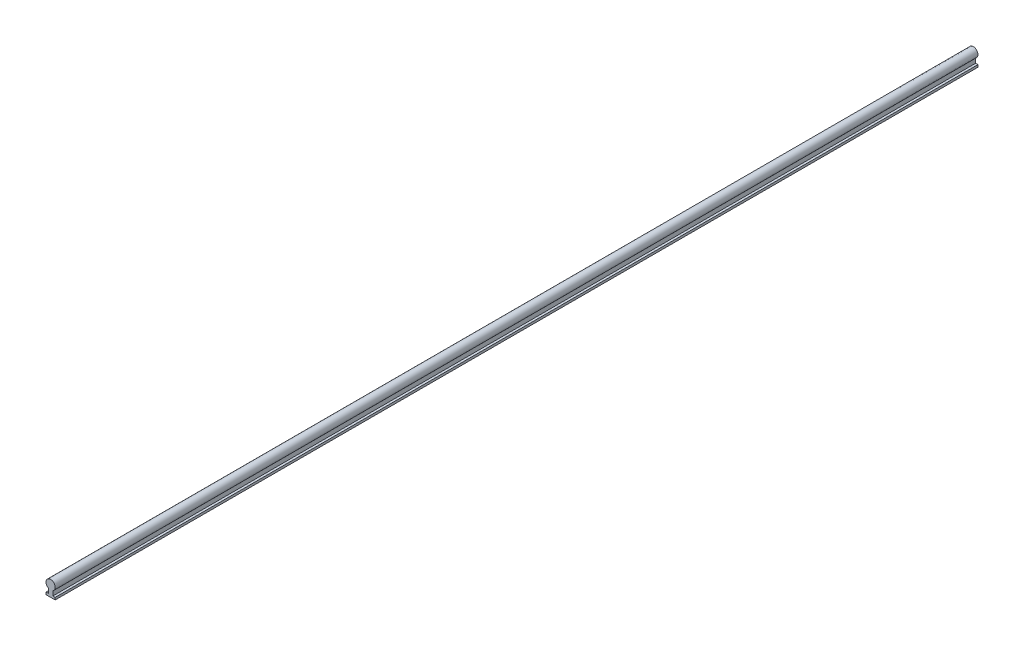
ISO-10303-21;
HEADER;
FILE_DESCRIPTION(('STEP AP214'),'2;1');
FILE_NAME('part.step','',(''),(''),'','','');
FILE_SCHEMA(('AUTOMOTIVE_DESIGN { 1 0 10303 214 1 1 1 1 }'));
ENDSEC;
DATA;
#1=APPLICATION_CONTEXT('core data for automotive mechanical design processes');
#2=APPLICATION_PROTOCOL_DEFINITION('international standard','automotive_design',2000,#1);
#3=PRODUCT_CONTEXT('',#1,'mechanical');
#4=PRODUCT('Part','Part','',(#3));
#5=PRODUCT_RELATED_PRODUCT_CATEGORY('part','',(#4));
#6=PRODUCT_DEFINITION_FORMATION('','',#4);
#7=PRODUCT_DEFINITION_CONTEXT('part definition',#1,'design');
#8=PRODUCT_DEFINITION('design','',#6,#7);
#9=PRODUCT_DEFINITION_SHAPE('','',#8);
#10=(LENGTH_UNIT() NAMED_UNIT(*) SI_UNIT(.MILLI.,.METRE.));
#11=(NAMED_UNIT(*) PLANE_ANGLE_UNIT() SI_UNIT($,.RADIAN.));
#12=(NAMED_UNIT(*) SI_UNIT($,.STERADIAN.) SOLID_ANGLE_UNIT());
#13=UNCERTAINTY_MEASURE_WITH_UNIT(LENGTH_MEASURE(1.E-05),#10,'distance_accuracy_value','');
#14=(GEOMETRIC_REPRESENTATION_CONTEXT(3) GLOBAL_UNCERTAINTY_ASSIGNED_CONTEXT((#13)) GLOBAL_UNIT_ASSIGNED_CONTEXT((#10,
#11,#12)) REPRESENTATION_CONTEXT('',''));
#15=CARTESIAN_POINT('',(0.,0.,0.));
#16=DIRECTION('',(0.,0.,1.));
#17=DIRECTION('',(1.,0.,0.));
#18=AXIS2_PLACEMENT_3D('',#15,#16,#17);
#19=CARTESIAN_POINT('',(5.,-5.,1000.));
#20=DIRECTION('',(-1.,0.,0.));
#21=DIRECTION('',(0.,0.,1.));
#22=AXIS2_PLACEMENT_3D('',#19,#20,#21);
#23=PLANE('',#22);
#24=DIRECTION('',(0.,1.,0.));
#25=VECTOR('',#24,1.);
#26=CARTESIAN_POINT('',(5.,-5.,0.));
#27=LINE('',#26,#25);
#28=CARTESIAN_POINT('',(5.,-5.,0.));
#29=VERTEX_POINT('',#28);
#30=CARTESIAN_POINT('',(5.,-2.5,0.));
#31=VERTEX_POINT('',#30);
#32=EDGE_CURVE('E140',#29,#31,#27,.T.);
#33=ORIENTED_EDGE('',*,*,#32,.T.);
#34=DIRECTION('',(0.,0.,-1.));
#35=VECTOR('',#34,1.);
#36=CARTESIAN_POINT('',(5.,-2.5,1000.));
#37=LINE('',#36,#35);
#38=CARTESIAN_POINT('',(5.,-2.5,1000.));
#39=VERTEX_POINT('',#38);
#40=EDGE_CURVE('E11',#39,#31,#37,.T.);
#41=ORIENTED_EDGE('',*,*,#40,.F.);
#42=DIRECTION('',(0.,1.,0.));
#43=VECTOR('',#42,1.);
#44=CARTESIAN_POINT('',(5.,-5.,1000.));
#45=LINE('',#44,#43);
#46=CARTESIAN_POINT('',(5.,-5.,1000.));
#47=VERTEX_POINT('',#46);
#48=EDGE_CURVE('E162',#47,#39,#45,.T.);
#49=ORIENTED_EDGE('',*,*,#48,.F.);
#50=DIRECTION('',(0.,0.,-1.));
#51=VECTOR('',#50,1.);
#52=CARTESIAN_POINT('',(5.,-5.,1000.));
#53=LINE('',#52,#51);
#54=EDGE_CURVE('E136',#47,#29,#53,.T.);
#55=ORIENTED_EDGE('',*,*,#54,.T.);
#56=EDGE_LOOP('',(#33,#41,#49,#55));
#57=FACE_BOUND('',#56,.T.);
#58=ADVANCED_FACE('F39',(#57),#23,.F.);
#59=CARTESIAN_POINT('',(2.5,-2.5,1000.));
#60=DIRECTION('',(0.,-1.,0.));
#61=DIRECTION('',(1.,0.,0.));
#62=AXIS2_PLACEMENT_3D('',#59,#60,#61);
#63=PLANE('',#62);
#64=DIRECTION('',(-1.,0.,0.));
#65=VECTOR('',#64,1.);
#66=CARTESIAN_POINT('',(2.5,-2.5,0.));
#67=LINE('',#66,#65);
#68=CARTESIAN_POINT('',(2.5,-2.5,0.));
#69=VERTEX_POINT('',#68);
#70=EDGE_CURVE('E144',#31,#69,#67,.T.);
#71=ORIENTED_EDGE('',*,*,#70,.T.);
#72=DIRECTION('',(0.,0.,-1.));
#73=VECTOR('',#72,1.);
#74=CARTESIAN_POINT('',(2.5,-2.5,1000.));
#75=LINE('',#74,#73);
#76=CARTESIAN_POINT('',(2.5,-2.5,1000.));
#77=VERTEX_POINT('',#76);
#78=EDGE_CURVE('E48',#77,#69,#75,.T.);
#79=ORIENTED_EDGE('',*,*,#78,.F.);
#80=DIRECTION('',(-1.,0.,0.));
#81=VECTOR('',#80,1.);
#82=CARTESIAN_POINT('',(2.5,-2.5,1000.));
#83=LINE('',#82,#81);
#84=EDGE_CURVE('E99',#39,#77,#83,.T.);
#85=ORIENTED_EDGE('',*,*,#84,.F.);
#86=ORIENTED_EDGE('',*,*,#40,.T.);
#87=EDGE_LOOP('',(#71,#79,#85,#86));
#88=FACE_BOUND('',#87,.T.);
#89=ADVANCED_FACE('F208',(#88),#63,.F.);
#90=CARTESIAN_POINT('',(2.5,-2.5,1000.));
#91=DIRECTION('',(-1.,0.,0.));
#92=DIRECTION('',(0.,-1.,0.));
#93=AXIS2_PLACEMENT_3D('',#90,#91,#92);
#94=PLANE('',#93);
#95=DIRECTION('',(0.,1.,0.));
#96=VECTOR('',#95,1.);
#97=CARTESIAN_POINT('',(2.5,-2.5,0.));
#98=LINE('',#97,#96);
#99=CARTESIAN_POINT('',(2.5,2.5,0.));
#100=VERTEX_POINT('',#99);
#101=EDGE_CURVE('E147',#69,#100,#98,.T.);
#102=ORIENTED_EDGE('',*,*,#101,.T.);
#103=DIRECTION('',(0.,0.,-1.));
#104=VECTOR('',#103,1.);
#105=CARTESIAN_POINT('',(2.5,2.5,1000.));
#106=LINE('',#105,#104);
#107=CARTESIAN_POINT('',(2.5,2.5,1000.));
#108=VERTEX_POINT('',#107);
#109=EDGE_CURVE('E173',#108,#100,#106,.T.);
#110=ORIENTED_EDGE('',*,*,#109,.F.);
#111=DIRECTION('',(0.,1.,0.));
#112=VECTOR('',#111,1.);
#113=CARTESIAN_POINT('',(2.5,-2.5,1000.));
#114=LINE('',#113,#112);
#115=EDGE_CURVE('E183',#77,#108,#114,.T.);
#116=ORIENTED_EDGE('',*,*,#115,.F.);
#117=ORIENTED_EDGE('',*,*,#78,.T.);
#118=EDGE_LOOP('',(#102,#110,#116,#117));
#119=FACE_BOUND('',#118,.T.);
#120=ADVANCED_FACE('F181',(#119),#94,.F.);
#121=CARTESIAN_POINT('',(0.,6.83012701892219,1000.));
#122=DIRECTION('',(0.,0.,-1.));
#123=DIRECTION('',(-1.,0.,0.));
#124=AXIS2_PLACEMENT_3D('',#121,#122,#123);
#125=CYLINDRICAL_SURFACE('',#124,5.);
#126=CARTESIAN_POINT('',(0.,6.83012701892219,0.));
#127=DIRECTION('',(0.,0.,1.));
#128=DIRECTION('',(1.,0.,0.));
#129=AXIS2_PLACEMENT_3D('',#126,#127,#128);
#130=CIRCLE('',#129,5.);
#131=CARTESIAN_POINT('',(-2.5,2.5,0.));
#132=VERTEX_POINT('',#131);
#133=EDGE_CURVE('E150',#100,#132,#130,.T.);
#134=ORIENTED_EDGE('',*,*,#133,.T.);
#135=DIRECTION('',(0.,0.,-1.));
#136=VECTOR('',#135,1.);
#137=CARTESIAN_POINT('',(-2.5,2.5,1000.));
#138=LINE('',#137,#136);
#139=CARTESIAN_POINT('',(-2.5,2.5,1000.));
#140=VERTEX_POINT('',#139);
#141=EDGE_CURVE('E169',#140,#132,#138,.T.);
#142=ORIENTED_EDGE('',*,*,#141,.F.);
#143=CARTESIAN_POINT('',(0.,6.83012701892219,1000.));
#144=DIRECTION('',(0.,0.,1.));
#145=DIRECTION('',(1.,0.,0.));
#146=AXIS2_PLACEMENT_3D('',#143,#144,#145);
#147=CIRCLE('',#146,5.);
#148=EDGE_CURVE('E196',#108,#140,#147,.T.);
#149=ORIENTED_EDGE('',*,*,#148,.F.);
#150=ORIENTED_EDGE('',*,*,#109,.T.);
#151=EDGE_LOOP('',(#134,#142,#149,#150));
#152=FACE_BOUND('',#151,.T.);
#153=ADVANCED_FACE('F191',(#152),#125,.T.);
#154=CARTESIAN_POINT('',(-2.5,-2.5,1000.));
#155=DIRECTION('',(1.,0.,0.));
#156=DIRECTION('',(0.,1.,0.));
#157=AXIS2_PLACEMENT_3D('',#154,#155,#156);
#158=PLANE('',#157);
#159=DIRECTION('',(0.,-1.,0.));
#160=VECTOR('',#159,1.);
#161=CARTESIAN_POINT('',(-2.5,-2.5,0.));
#162=LINE('',#161,#160);
#163=CARTESIAN_POINT('',(-2.5,-2.5,0.));
#164=VERTEX_POINT('',#163);
#165=EDGE_CURVE('E153',#132,#164,#162,.T.);
#166=ORIENTED_EDGE('',*,*,#165,.T.);
#167=DIRECTION('',(0.,0.,-1.));
#168=VECTOR('',#167,1.);
#169=CARTESIAN_POINT('',(-2.5,-2.5,1000.));
#170=LINE('',#169,#168);
#171=CARTESIAN_POINT('',(-2.5,-2.5,1000.));
#172=VERTEX_POINT('',#171);
#173=EDGE_CURVE('E129',#172,#164,#170,.T.);
#174=ORIENTED_EDGE('',*,*,#173,.F.);
#175=DIRECTION('',(0.,-1.,0.));
#176=VECTOR('',#175,1.);
#177=CARTESIAN_POINT('',(-2.5,-2.5,1000.));
#178=LINE('',#177,#176);
#179=EDGE_CURVE('E118',#140,#172,#178,.T.);
#180=ORIENTED_EDGE('',*,*,#179,.F.);
#181=ORIENTED_EDGE('',*,*,#141,.T.);
#182=EDGE_LOOP('',(#166,#174,#180,#181));
#183=FACE_BOUND('',#182,.T.);
#184=ADVANCED_FACE('F194',(#183),#158,.F.);
#185=CARTESIAN_POINT('',(-5.,-2.5,1000.));
#186=DIRECTION('',(0.,-1.,0.));
#187=DIRECTION('',(1.,0.,0.));
#188=AXIS2_PLACEMENT_3D('',#185,#186,#187);
#189=PLANE('',#188);
#190=DIRECTION('',(-1.,0.,0.));
#191=VECTOR('',#190,1.);
#192=CARTESIAN_POINT('',(-5.,-2.5,0.));
#193=LINE('',#192,#191);
#194=CARTESIAN_POINT('',(-5.,-2.5,0.));
#195=VERTEX_POINT('',#194);
#196=EDGE_CURVE('E127',#164,#195,#193,.T.);
#197=ORIENTED_EDGE('',*,*,#196,.T.);
#198=DIRECTION('',(0.,0.,-1.));
#199=VECTOR('',#198,1.);
#200=CARTESIAN_POINT('',(-5.,-2.5,1000.));
#201=LINE('',#200,#199);
#202=CARTESIAN_POINT('',(-5.,-2.5,1000.));
#203=VERTEX_POINT('',#202);
#204=EDGE_CURVE('E124',#203,#195,#201,.T.);
#205=ORIENTED_EDGE('',*,*,#204,.F.);
#206=DIRECTION('',(-1.,0.,0.));
#207=VECTOR('',#206,1.);
#208=CARTESIAN_POINT('',(-5.,-2.5,1000.));
#209=LINE('',#208,#207);
#210=EDGE_CURVE('E112',#172,#203,#209,.T.);
#211=ORIENTED_EDGE('',*,*,#210,.F.);
#212=ORIENTED_EDGE('',*,*,#173,.T.);
#213=EDGE_LOOP('',(#197,#205,#211,#212));
#214=FACE_BOUND('',#213,.T.);
#215=ADVANCED_FACE('F125',(#214),#189,.F.);
#216=CARTESIAN_POINT('',(-5.,-5.,1000.));
#217=DIRECTION('',(1.,0.,0.));
#218=DIRECTION('',(0.,0.,-1.));
#219=AXIS2_PLACEMENT_3D('',#216,#217,#218);
#220=PLANE('',#219);
#221=DIRECTION('',(0.,-1.,0.));
#222=VECTOR('',#221,1.);
#223=CARTESIAN_POINT('',(-5.,-5.,0.));
#224=LINE('',#223,#222);
#225=CARTESIAN_POINT('',(-5.,-5.,0.));
#226=VERTEX_POINT('',#225);
#227=EDGE_CURVE('E85',#195,#226,#224,.T.);
#228=ORIENTED_EDGE('',*,*,#227,.T.);
#229=DIRECTION('',(0.,0.,-1.));
#230=VECTOR('',#229,1.);
#231=CARTESIAN_POINT('',(-5.,-5.,1000.));
#232=LINE('',#231,#230);
#233=CARTESIAN_POINT('',(-5.,-5.,1000.));
#234=VERTEX_POINT('',#233);
#235=EDGE_CURVE('E130',#234,#226,#232,.T.);
#236=ORIENTED_EDGE('',*,*,#235,.F.);
#237=DIRECTION('',(0.,-1.,0.));
#238=VECTOR('',#237,1.);
#239=CARTESIAN_POINT('',(-5.,-5.,1000.));
#240=LINE('',#239,#238);
#241=EDGE_CURVE('E116',#203,#234,#240,.T.);
#242=ORIENTED_EDGE('',*,*,#241,.F.);
#243=ORIENTED_EDGE('',*,*,#204,.T.);
#244=EDGE_LOOP('',(#228,#236,#242,#243));
#245=FACE_BOUND('',#244,.T.);
#246=ADVANCED_FACE('F132',(#245),#220,.F.);
#247=CARTESIAN_POINT('',(-5.,-5.,1000.));
#248=DIRECTION('',(0.,1.,0.));
#249=DIRECTION('',(0.,0.,1.));
#250=AXIS2_PLACEMENT_3D('',#247,#248,#249);
#251=PLANE('',#250);
#252=DIRECTION('',(1.,0.,0.));
#253=VECTOR('',#252,1.);
#254=CARTESIAN_POINT('',(-5.,-5.,0.));
#255=LINE('',#254,#253);
#256=EDGE_CURVE('E91',#226,#29,#255,.T.);
#257=ORIENTED_EDGE('',*,*,#256,.T.);
#258=ORIENTED_EDGE('',*,*,#54,.F.);
#259=DIRECTION('',(1.,0.,0.));
#260=VECTOR('',#259,1.);
#261=CARTESIAN_POINT('',(-5.,-5.,1000.));
#262=LINE('',#261,#260);
#263=EDGE_CURVE('E56',#234,#47,#262,.T.);
#264=ORIENTED_EDGE('',*,*,#263,.F.);
#265=ORIENTED_EDGE('',*,*,#235,.T.);
#266=EDGE_LOOP('',(#257,#258,#264,#265));
#267=FACE_BOUND('',#266,.T.);
#268=ADVANCED_FACE('F224',(#267),#251,.F.);
#269=CARTESIAN_POINT('',(0.,6.83012701892219,1000.));
#270=DIRECTION('',(0.,0.,1.));
#271=DIRECTION('',(1.,0.,0.));
#272=AXIS2_PLACEMENT_3D('',#269,#270,#271);
#273=PLANE('',#272);
#274=ORIENTED_EDGE('',*,*,#48,.T.);
#275=ORIENTED_EDGE('',*,*,#84,.T.);
#276=ORIENTED_EDGE('',*,*,#115,.T.);
#277=ORIENTED_EDGE('',*,*,#148,.T.);
#278=ORIENTED_EDGE('',*,*,#179,.T.);
#279=ORIENTED_EDGE('',*,*,#210,.T.);
#280=ORIENTED_EDGE('',*,*,#241,.T.);
#281=ORIENTED_EDGE('',*,*,#263,.T.);
#282=EDGE_LOOP('',(#274,#275,#276,#277,#278,#279,#280,#281));
#283=FACE_BOUND('',#282,.T.);
#284=ADVANCED_FACE('F114',(#283),#273,.T.);
#285=CARTESIAN_POINT('',(0.,6.83012701892219,0.));
#286=DIRECTION('',(0.,0.,1.));
#287=DIRECTION('',(1.,0.,0.));
#288=AXIS2_PLACEMENT_3D('',#285,#286,#287);
#289=PLANE('',#288);
#290=ORIENTED_EDGE('',*,*,#32,.F.);
#291=ORIENTED_EDGE('',*,*,#256,.F.);
#292=ORIENTED_EDGE('',*,*,#227,.F.);
#293=ORIENTED_EDGE('',*,*,#196,.F.);
#294=ORIENTED_EDGE('',*,*,#165,.F.);
#295=ORIENTED_EDGE('',*,*,#133,.F.);
#296=ORIENTED_EDGE('',*,*,#101,.F.);
#297=ORIENTED_EDGE('',*,*,#70,.F.);
#298=EDGE_LOOP('',(#290,#291,#292,#293,#294,#295,#296,#297));
#299=FACE_BOUND('',#298,.T.);
#300=ADVANCED_FACE('F187',(#299),#289,.F.);
#301=CLOSED_SHELL('',(#58,#89,#120,#153,#184,#215,#246,#268,#284,#300));
#302=MANIFOLD_SOLID_BREP('B2',#301);
#303=ADVANCED_BREP_SHAPE_REPRESENTATION('',(#18,#302),#14);
#304=SHAPE_DEFINITION_REPRESENTATION(#9,#303);
ENDSEC;
END-ISO-10303-21;
